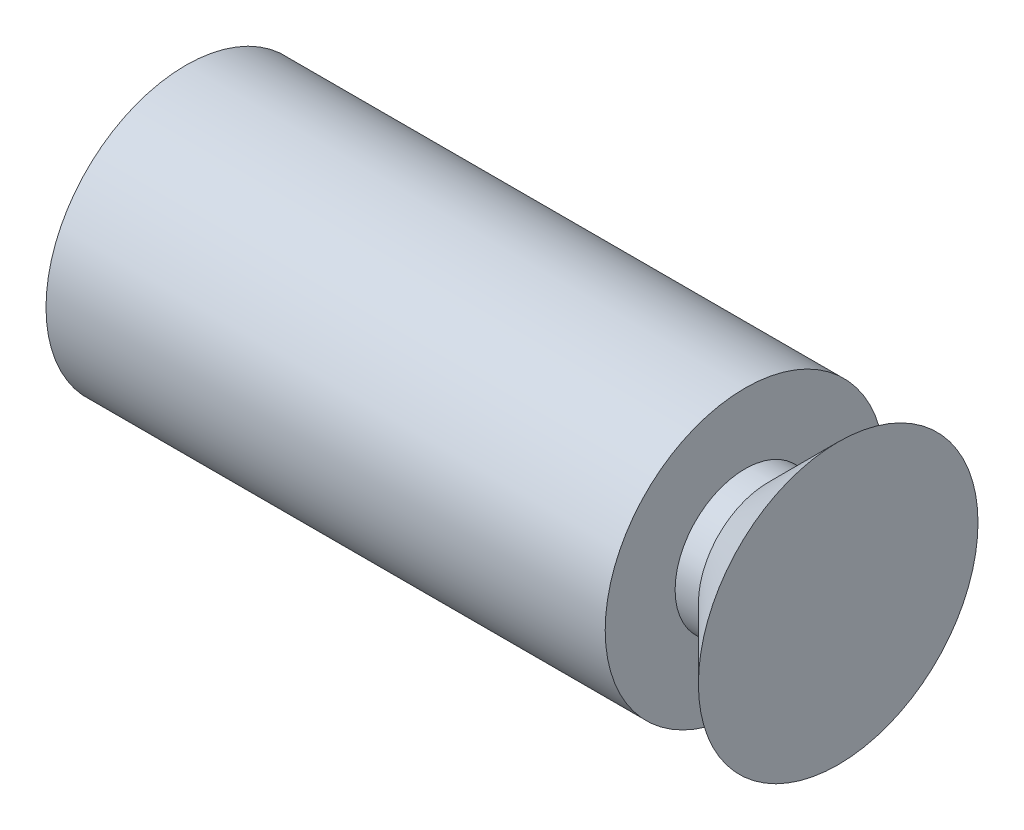
ISO-10303-21;
HEADER;
FILE_DESCRIPTION(('STEP AP214'),'2;1');
FILE_NAME('part.step','',(''),(''),'','','');
FILE_SCHEMA(('AUTOMOTIVE_DESIGN { 1 0 10303 214 1 1 1 1 }'));
ENDSEC;
DATA;
#1=APPLICATION_CONTEXT('core data for automotive mechanical design processes');
#2=APPLICATION_PROTOCOL_DEFINITION('international standard','automotive_design',2000,#1);
#3=PRODUCT_CONTEXT('',#1,'mechanical');
#4=PRODUCT('Part','Part','',(#3));
#5=PRODUCT_RELATED_PRODUCT_CATEGORY('part','',(#4));
#6=PRODUCT_DEFINITION_FORMATION('','',#4);
#7=PRODUCT_DEFINITION_CONTEXT('part definition',#1,'design');
#8=PRODUCT_DEFINITION('design','',#6,#7);
#9=PRODUCT_DEFINITION_SHAPE('','',#8);
#10=(LENGTH_UNIT() NAMED_UNIT(*) SI_UNIT(.MILLI.,.METRE.));
#11=(NAMED_UNIT(*) PLANE_ANGLE_UNIT() SI_UNIT($,.RADIAN.));
#12=(NAMED_UNIT(*) SI_UNIT($,.STERADIAN.) SOLID_ANGLE_UNIT());
#13=UNCERTAINTY_MEASURE_WITH_UNIT(LENGTH_MEASURE(1.E-05),#10,'distance_accuracy_value','');
#14=(GEOMETRIC_REPRESENTATION_CONTEXT(3) GLOBAL_UNCERTAINTY_ASSIGNED_CONTEXT((#13)) GLOBAL_UNIT_ASSIGNED_CONTEXT((#10,
#11,#12)) REPRESENTATION_CONTEXT('',''));
#15=CARTESIAN_POINT('',(0.,0.,0.));
#16=DIRECTION('',(0.,0.,1.));
#17=DIRECTION('',(1.,0.,0.));
#18=AXIS2_PLACEMENT_3D('',#15,#16,#17);
#19=CARTESIAN_POINT('',(5.5,0.,0.));
#20=DIRECTION('',(1.,0.,0.));
#21=DIRECTION('',(0.,0.,-1.));
#22=AXIS2_PLACEMENT_3D('',#19,#20,#21);
#23=PLANE('',#22);
#24=CARTESIAN_POINT('',(5.50000000000001,0.,0.));
#25=DIRECTION('',(-1.,0.,0.));
#26=DIRECTION('',(0.,0.,1.));
#27=AXIS2_PLACEMENT_3D('',#24,#25,#26);
#28=CIRCLE('',#27,3.);
#29=CARTESIAN_POINT('',(5.50000000000001,0.,3.));
#30=VERTEX_POINT('',#29);
#31=EDGE_CURVE('E11',#30,#30,#28,.T.);
#32=ORIENTED_EDGE('',*,*,#31,.F.);
#33=EDGE_LOOP('',(#32));
#34=FACE_BOUND('',#33,.T.);
#35=ADVANCED_FACE('F31',(#34),#23,.T.);
#36=CARTESIAN_POINT('',(3.99999999999999,0.,0.));
#37=DIRECTION('',(1.,0.,0.));
#38=DIRECTION('',(0.,0.,-1.));
#39=AXIS2_PLACEMENT_3D('',#36,#37,#38);
#40=CONICAL_SURFACE('',#39,1.5,0.785398163397443);
#41=ORIENTED_EDGE('',*,*,#31,.T.);
#42=EDGE_LOOP('',(#41));
#43=FACE_BOUND('',#42,.T.);
#44=CARTESIAN_POINT('',(3.99999999999999,0.,0.));
#45=DIRECTION('',(-1.,0.,0.));
#46=DIRECTION('',(0.,0.,1.));
#47=AXIS2_PLACEMENT_3D('',#44,#45,#46);
#48=CIRCLE('',#47,1.5);
#49=CARTESIAN_POINT('',(3.99999999999999,0.,1.5));
#50=VERTEX_POINT('',#49);
#51=EDGE_CURVE('E37',#50,#50,#48,.T.);
#52=ORIENTED_EDGE('',*,*,#51,.F.);
#53=EDGE_LOOP('',(#52));
#54=FACE_BOUND('',#53,.T.);
#55=ADVANCED_FACE('F53',(#43,#54),#40,.T.);
#56=CARTESIAN_POINT('',(-97.0893551688843,0.,0.));
#57=DIRECTION('',(-1.,0.,0.));
#58=DIRECTION('',(0.,0.,1.));
#59=AXIS2_PLACEMENT_3D('',#56,#57,#58);
#60=CYLINDRICAL_SURFACE('',#59,1.5);
#61=ORIENTED_EDGE('',*,*,#51,.T.);
#62=EDGE_LOOP('',(#61));
#63=FACE_BOUND('',#62,.T.);
#64=CARTESIAN_POINT('',(3.5,0.,0.));
#65=DIRECTION('',(-1.,0.,0.));
#66=DIRECTION('',(0.,0.,1.));
#67=AXIS2_PLACEMENT_3D('',#64,#65,#66);
#68=CIRCLE('',#67,1.5);
#69=CARTESIAN_POINT('',(3.5,0.,1.5));
#70=VERTEX_POINT('',#69);
#71=EDGE_CURVE('E65',#70,#70,#68,.T.);
#72=ORIENTED_EDGE('',*,*,#71,.F.);
#73=EDGE_LOOP('',(#72));
#74=FACE_BOUND('',#73,.T.);
#75=ADVANCED_FACE('F58',(#63,#74),#60,.T.);
#76=CARTESIAN_POINT('',(3.5,-1.5,0.));
#77=DIRECTION('',(1.,0.,0.));
#78=DIRECTION('',(0.,0.,-1.));
#79=AXIS2_PLACEMENT_3D('',#76,#77,#78);
#80=PLANE('',#79);
#81=ORIENTED_EDGE('',*,*,#71,.T.);
#82=EDGE_LOOP('',(#81));
#83=FACE_BOUND('',#82,.T.);
#84=CARTESIAN_POINT('',(3.5,0.,0.));
#85=DIRECTION('',(-1.,0.,0.));
#86=DIRECTION('',(0.,0.,1.));
#87=AXIS2_PLACEMENT_3D('',#84,#85,#86);
#88=CIRCLE('',#87,3.00000000000001);
#89=CARTESIAN_POINT('',(3.5,0.,3.00000000000001));
#90=VERTEX_POINT('',#89);
#91=EDGE_CURVE('E67',#90,#90,#88,.T.);
#92=ORIENTED_EDGE('',*,*,#91,.F.);
#93=EDGE_LOOP('',(#92));
#94=FACE_BOUND('',#93,.T.);
#95=ADVANCED_FACE('F90',(#83,#94),#80,.T.);
#96=CARTESIAN_POINT('',(-97.0893551688843,0.,0.));
#97=DIRECTION('',(-1.,0.,0.));
#98=DIRECTION('',(0.,0.,1.));
#99=AXIS2_PLACEMENT_3D('',#96,#97,#98);
#100=CYLINDRICAL_SURFACE('',#99,3.00000000000001);
#101=ORIENTED_EDGE('',*,*,#91,.T.);
#102=EDGE_LOOP('',(#101));
#103=FACE_BOUND('',#102,.T.);
#104=CARTESIAN_POINT('',(-8.49999999999999,0.,0.));
#105=DIRECTION('',(-1.,0.,0.));
#106=DIRECTION('',(0.,0.,1.));
#107=AXIS2_PLACEMENT_3D('',#104,#105,#106);
#108=CIRCLE('',#107,3.00000000000001);
#109=CARTESIAN_POINT('',(-8.49999999999999,0.,3.00000000000001));
#110=VERTEX_POINT('',#109);
#111=EDGE_CURVE('E72',#110,#110,#108,.T.);
#112=ORIENTED_EDGE('',*,*,#111,.F.);
#113=EDGE_LOOP('',(#112));
#114=FACE_BOUND('',#113,.T.);
#115=ADVANCED_FACE('F84',(#103,#114),#100,.T.);
#116=CARTESIAN_POINT('',(-8.49999999999999,-3.00000000000001,0.));
#117=DIRECTION('',(-1.,0.,0.));
#118=DIRECTION('',(0.,0.,1.));
#119=AXIS2_PLACEMENT_3D('',#116,#117,#118);
#120=PLANE('',#119);
#121=ORIENTED_EDGE('',*,*,#111,.T.);
#122=EDGE_LOOP('',(#121));
#123=FACE_BOUND('',#122,.T.);
#124=CARTESIAN_POINT('',(-8.49999999999999,0.,0.));
#125=DIRECTION('',(-1.,0.,0.));
#126=DIRECTION('',(0.,0.,1.));
#127=AXIS2_PLACEMENT_3D('',#124,#125,#126);
#128=CIRCLE('',#127,1.2);
#129=CARTESIAN_POINT('',(-8.49999999999999,0.,1.2));
#130=VERTEX_POINT('',#129);
#131=EDGE_CURVE('E75',#130,#130,#128,.T.);
#132=ORIENTED_EDGE('',*,*,#131,.F.);
#133=EDGE_LOOP('',(#132));
#134=FACE_BOUND('',#133,.T.);
#135=ADVANCED_FACE('F48',(#123,#134),#120,.T.);
#136=CARTESIAN_POINT('',(-97.0893551688843,0.,0.));
#137=DIRECTION('',(-1.,0.,0.));
#138=DIRECTION('',(0.,0.,1.));
#139=AXIS2_PLACEMENT_3D('',#136,#137,#138);
#140=CYLINDRICAL_SURFACE('',#139,1.2);
#141=ORIENTED_EDGE('',*,*,#131,.T.);
#142=EDGE_LOOP('',(#141));
#143=FACE_BOUND('',#142,.T.);
#144=CARTESIAN_POINT('',(-0.5,0.,0.));
#145=DIRECTION('',(-1.,0.,0.));
#146=DIRECTION('',(0.,0.,1.));
#147=AXIS2_PLACEMENT_3D('',#144,#145,#146);
#148=CIRCLE('',#147,1.2);
#149=CARTESIAN_POINT('',(-0.5,0.,1.2));
#150=VERTEX_POINT('',#149);
#151=EDGE_CURVE('E78',#150,#150,#148,.T.);
#152=ORIENTED_EDGE('',*,*,#151,.F.);
#153=EDGE_LOOP('',(#152));
#154=FACE_BOUND('',#153,.T.);
#155=ADVANCED_FACE('F42',(#143,#154),#140,.F.);
#156=CARTESIAN_POINT('',(0.299999999999995,0.,0.));
#157=DIRECTION('',(-1.,0.,0.));
#158=DIRECTION('',(0.,0.,1.));
#159=AXIS2_PLACEMENT_3D('',#156,#157,#158);
#160=CONICAL_SURFACE('',#159,0.,0.982793723247332);
#161=ORIENTED_EDGE('',*,*,#151,.T.);
#162=EDGE_LOOP('',(#161));
#163=FACE_BOUND('',#162,.T.);
#164=CARTESIAN_POINT('',(0.299999999999995,0.,0.));
#165=VERTEX_POINT('',#164);
#166=VERTEX_LOOP('',#165);
#167=FACE_BOUND('',#166,.T.);
#168=ADVANCED_FACE('F40',(#163,#167),#160,.F.);
#169=CLOSED_SHELL('',(#35,#55,#75,#95,#115,#135,#155,#168));
#170=MANIFOLD_SOLID_BREP('B2',#169);
#171=ADVANCED_BREP_SHAPE_REPRESENTATION('',(#18,#170),#14);
#172=SHAPE_DEFINITION_REPRESENTATION(#9,#171);
ENDSEC;
END-ISO-10303-21;
